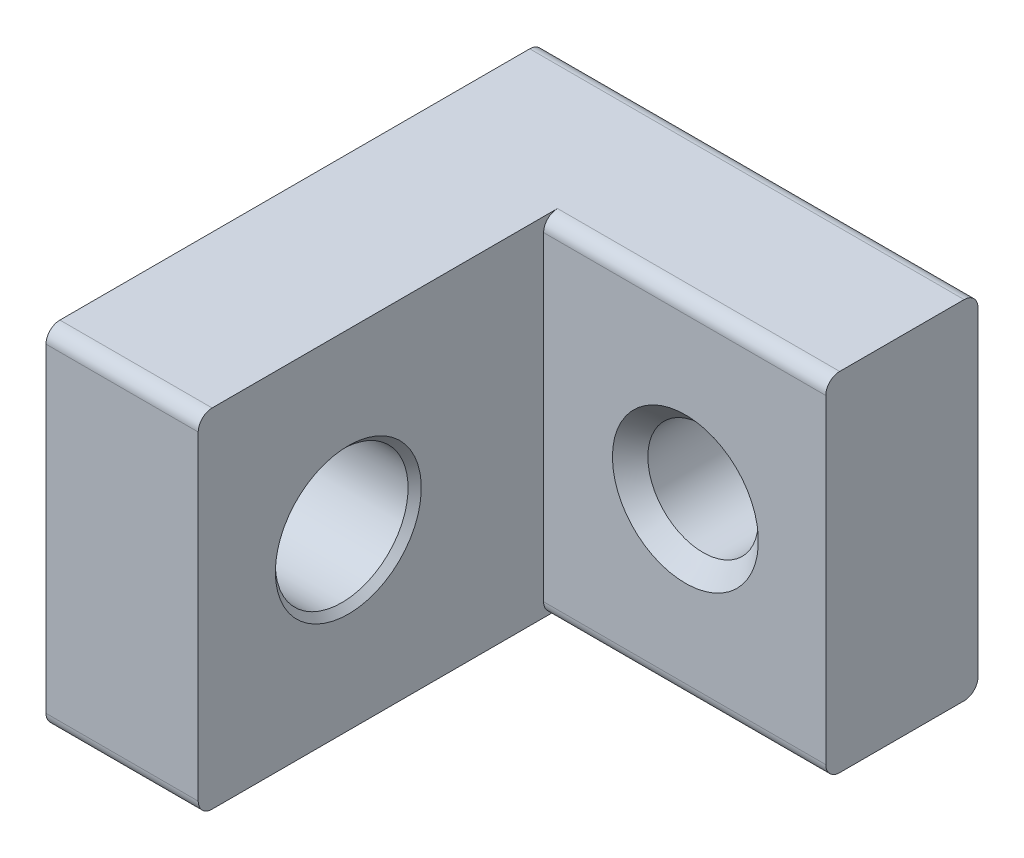
ISO-10303-21;
HEADER;
FILE_DESCRIPTION(('STEP AP214'),'2;1');
FILE_NAME('part.step','',(''),(''),'','','');
FILE_SCHEMA(('AUTOMOTIVE_DESIGN { 1 0 10303 214 1 1 1 1 }'));
ENDSEC;
DATA;
#1=APPLICATION_CONTEXT('core data for automotive mechanical design processes');
#2=APPLICATION_PROTOCOL_DEFINITION('international standard','automotive_design',2000,#1);
#3=PRODUCT_CONTEXT('',#1,'mechanical');
#4=PRODUCT('Part','Part','',(#3));
#5=PRODUCT_RELATED_PRODUCT_CATEGORY('part','',(#4));
#6=PRODUCT_DEFINITION_FORMATION('','',#4);
#7=PRODUCT_DEFINITION_CONTEXT('part definition',#1,'design');
#8=PRODUCT_DEFINITION('design','',#6,#7);
#9=PRODUCT_DEFINITION_SHAPE('','',#8);
#10=(LENGTH_UNIT() NAMED_UNIT(*) SI_UNIT(.MILLI.,.METRE.));
#11=(NAMED_UNIT(*) PLANE_ANGLE_UNIT() SI_UNIT($,.RADIAN.));
#12=(NAMED_UNIT(*) SI_UNIT($,.STERADIAN.) SOLID_ANGLE_UNIT());
#13=UNCERTAINTY_MEASURE_WITH_UNIT(LENGTH_MEASURE(1.E-05),#10,'distance_accuracy_value','');
#14=(GEOMETRIC_REPRESENTATION_CONTEXT(3) GLOBAL_UNCERTAINTY_ASSIGNED_CONTEXT((#13)) GLOBAL_UNIT_ASSIGNED_CONTEXT((#10,
#11,#12)) REPRESENTATION_CONTEXT('',''));
#15=CARTESIAN_POINT('',(0.,0.,0.));
#16=DIRECTION('',(0.,0.,1.));
#17=DIRECTION('',(1.,0.,0.));
#18=AXIS2_PLACEMENT_3D('',#15,#16,#17);
#19=CARTESIAN_POINT('',(0.381,6.35,0.));
#20=DIRECTION('',(1.,0.,0.));
#21=DIRECTION('',(0.,0.,-1.));
#22=AXIS2_PLACEMENT_3D('',#19,#20,#21);
#23=PLANE('',#22);
#24=CARTESIAN_POINT('',(0.381000000000002,0.,12.7));
#25=DIRECTION('',(-1.,0.,0.));
#26=DIRECTION('',(0.,0.,1.));
#27=AXIS2_PLACEMENT_3D('',#24,#25,#26);
#28=CIRCLE('',#27,2.667);
#29=CARTESIAN_POINT('',(0.381000000000002,0.,15.367));
#30=VERTEX_POINT('',#29);
#31=EDGE_CURVE('E248',#30,#30,#28,.T.);
#32=ORIENTED_EDGE('',*,*,#31,.F.);
#33=EDGE_LOOP('',(#32));
#34=FACE_BOUND('',#33,.T.);
#35=DIRECTION('',(0.,-1.,0.));
#36=VECTOR('',#35,1.);
#37=CARTESIAN_POINT('',(0.381,6.35,0.));
#38=LINE('',#37,#36);
#39=CARTESIAN_POINT('',(0.381,5.842,0.));
#40=VERTEX_POINT('',#39);
#41=CARTESIAN_POINT('',(0.381,-5.842,0.));
#42=VERTEX_POINT('',#41);
#43=EDGE_CURVE('E131',#40,#42,#38,.T.);
#44=ORIENTED_EDGE('',*,*,#43,.T.);
#45=CARTESIAN_POINT('',(0.381,-5.842,0.508));
#46=DIRECTION('',(1.,0.,0.));
#47=DIRECTION('',(0.,0.,-1.));
#48=AXIS2_PLACEMENT_3D('',#45,#46,#47);
#49=CIRCLE('',#48,0.508);
#50=CARTESIAN_POINT('',(0.381,-6.35,0.508));
#51=VERTEX_POINT('',#50);
#52=EDGE_CURVE('E167',#42,#51,#49,.F.);
#53=ORIENTED_EDGE('',*,*,#52,.T.);
#54=DIRECTION('',(0.,0.,1.));
#55=VECTOR('',#54,1.);
#56=CARTESIAN_POINT('',(0.381,-6.35,0.));
#57=LINE('',#56,#55);
#58=CARTESIAN_POINT('',(0.381000000000002,-6.35,17.6784));
#59=VERTEX_POINT('',#58);
#60=EDGE_CURVE('E235',#51,#59,#57,.T.);
#61=ORIENTED_EDGE('',*,*,#60,.T.);
#62=CARTESIAN_POINT('',(0.381000000000002,-5.842,17.6784));
#63=DIRECTION('',(1.,0.,0.));
#64=DIRECTION('',(0.,0.,-1.));
#65=AXIS2_PLACEMENT_3D('',#62,#63,#64);
#66=CIRCLE('',#65,0.508);
#67=CARTESIAN_POINT('',(0.381000000000002,-5.842,18.1864));
#68=VERTEX_POINT('',#67);
#69=EDGE_CURVE('E165',#59,#68,#66,.F.);
#70=ORIENTED_EDGE('',*,*,#69,.T.);
#71=DIRECTION('',(0.,-1.,0.));
#72=VECTOR('',#71,1.);
#73=CARTESIAN_POINT('',(0.381000000000002,6.35,18.1864));
#74=LINE('',#73,#72);
#75=CARTESIAN_POINT('',(0.381000000000002,5.842,18.1864));
#76=VERTEX_POINT('',#75);
#77=EDGE_CURVE('E154',#76,#68,#74,.T.);
#78=ORIENTED_EDGE('',*,*,#77,.F.);
#79=CARTESIAN_POINT('',(0.381000000000002,5.842,17.6784));
#80=DIRECTION('',(1.,0.,0.));
#81=DIRECTION('',(0.,0.,-1.));
#82=AXIS2_PLACEMENT_3D('',#79,#80,#81);
#83=CIRCLE('',#82,0.508);
#84=CARTESIAN_POINT('',(0.381000000000002,6.35,17.6784));
#85=VERTEX_POINT('',#84);
#86=EDGE_CURVE('E138',#76,#85,#83,.F.);
#87=ORIENTED_EDGE('',*,*,#86,.T.);
#88=DIRECTION('',(0.,0.,1.));
#89=VECTOR('',#88,1.);
#90=CARTESIAN_POINT('',(0.381,6.35,0.));
#91=LINE('',#90,#89);
#92=CARTESIAN_POINT('',(0.381,6.35,0.508000000000002));
#93=VERTEX_POINT('',#92);
#94=EDGE_CURVE('E133',#93,#85,#91,.T.);
#95=ORIENTED_EDGE('',*,*,#94,.F.);
#96=CARTESIAN_POINT('',(0.381,5.842,0.508000000000002));
#97=DIRECTION('',(1.,0.,0.));
#98=DIRECTION('',(0.,0.,-1.));
#99=AXIS2_PLACEMENT_3D('',#96,#97,#98);
#100=CIRCLE('',#99,0.508);
#101=EDGE_CURVE('E129',#93,#40,#100,.F.);
#102=ORIENTED_EDGE('',*,*,#101,.T.);
#103=EDGE_LOOP('',(#44,#53,#61,#70,#78,#87,#95,#102));
#104=FACE_BOUND('',#103,.T.);
#105=ADVANCED_FACE('F39',(#34,#104),#23,.F.);
#106=CARTESIAN_POINT('',(0.381000000000002,6.35,18.1864));
#107=DIRECTION('',(0.,0.,-1.));
#108=DIRECTION('',(-1.,0.,0.));
#109=AXIS2_PLACEMENT_3D('',#106,#107,#108);
#110=PLANE('',#109);
#111=ORIENTED_EDGE('',*,*,#77,.T.);
#112=DIRECTION('',(1.,0.,0.));
#113=VECTOR('',#112,1.);
#114=CARTESIAN_POINT('',(0.381000000000002,-5.842,18.1864));
#115=LINE('',#114,#113);
#116=CARTESIAN_POINT('',(5.9436,-5.842,18.1864));
#117=VERTEX_POINT('',#116);
#118=EDGE_CURVE('E190',#68,#117,#115,.T.);
#119=ORIENTED_EDGE('',*,*,#118,.T.);
#120=DIRECTION('',(0.,-1.,0.));
#121=VECTOR('',#120,1.);
#122=CARTESIAN_POINT('',(5.9436,6.35,18.1864));
#123=LINE('',#122,#121);
#124=CARTESIAN_POINT('',(5.9436,5.842,18.1864));
#125=VERTEX_POINT('',#124);
#126=EDGE_CURVE('E159',#125,#117,#123,.T.);
#127=ORIENTED_EDGE('',*,*,#126,.F.);
#128=DIRECTION('',(1.,0.,0.));
#129=VECTOR('',#128,1.);
#130=CARTESIAN_POINT('',(0.381000000000002,5.842,18.1864));
#131=LINE('',#130,#129);
#132=EDGE_CURVE('E188',#125,#76,#131,.F.);
#133=ORIENTED_EDGE('',*,*,#132,.T.);
#134=EDGE_LOOP('',(#111,#119,#127,#133));
#135=FACE_BOUND('',#134,.T.);
#136=ADVANCED_FACE('F294',(#135),#110,.F.);
#137=CARTESIAN_POINT('',(5.9436,6.35,18.1864));
#138=DIRECTION('',(-1.,0.,0.));
#139=DIRECTION('',(0.,0.,1.));
#140=AXIS2_PLACEMENT_3D('',#137,#138,#139);
#141=PLANE('',#140);
#142=CARTESIAN_POINT('',(5.9436,0.,12.7));
#143=DIRECTION('',(-1.,0.,0.));
#144=DIRECTION('',(0.,0.,1.));
#145=AXIS2_PLACEMENT_3D('',#142,#143,#144);
#146=CIRCLE('',#145,2.667);
#147=CARTESIAN_POINT('',(5.9436,0.,15.367));
#148=VERTEX_POINT('',#147);
#149=EDGE_CURVE('E263',#148,#148,#146,.T.);
#150=ORIENTED_EDGE('',*,*,#149,.T.);
#151=EDGE_LOOP('',(#150));
#152=FACE_BOUND('',#151,.T.);
#153=ORIENTED_EDGE('',*,*,#126,.T.);
#154=CARTESIAN_POINT('',(5.9436,-5.842,17.6784));
#155=DIRECTION('',(-1.,0.,0.));
#156=DIRECTION('',(0.,0.,1.));
#157=AXIS2_PLACEMENT_3D('',#154,#155,#156);
#158=CIRCLE('',#157,0.508);
#159=CARTESIAN_POINT('',(5.9436,-6.35,17.6784));
#160=VERTEX_POINT('',#159);
#161=EDGE_CURVE('E194',#117,#160,#158,.F.);
#162=ORIENTED_EDGE('',*,*,#161,.T.);
#163=DIRECTION('',(0.,0.,-1.));
#164=VECTOR('',#163,1.);
#165=CARTESIAN_POINT('',(5.9436,-6.35,18.1864));
#166=LINE('',#165,#164);
#167=CARTESIAN_POINT('',(5.9436,-6.35,5.0546));
#168=VERTEX_POINT('',#167);
#169=EDGE_CURVE('E210',#160,#168,#166,.T.);
#170=ORIENTED_EDGE('',*,*,#169,.T.);
#171=CARTESIAN_POINT('',(5.9436,-5.842,5.0546));
#172=DIRECTION('',(-1.,0.,0.));
#173=DIRECTION('',(0.,0.,1.));
#174=AXIS2_PLACEMENT_3D('',#171,#172,#173);
#175=CIRCLE('',#174,0.508);
#176=CARTESIAN_POINT('',(5.9436,-5.842,5.5626));
#177=VERTEX_POINT('',#176);
#178=EDGE_CURVE('E47',#168,#177,#175,.T.);
#179=ORIENTED_EDGE('',*,*,#178,.T.);
#180=DIRECTION('',(0.,-1.,0.));
#181=VECTOR('',#180,1.);
#182=CARTESIAN_POINT('',(5.9436,6.35,5.5626));
#183=LINE('',#182,#181);
#184=CARTESIAN_POINT('',(5.9436,5.842,5.5626));
#185=VERTEX_POINT('',#184);
#186=EDGE_CURVE('E207',#185,#177,#183,.T.);
#187=ORIENTED_EDGE('',*,*,#186,.F.);
#188=CARTESIAN_POINT('',(5.9436,5.842,5.0546));
#189=DIRECTION('',(-1.,0.,0.));
#190=DIRECTION('',(0.,0.,1.));
#191=AXIS2_PLACEMENT_3D('',#188,#189,#190);
#192=CIRCLE('',#191,0.508);
#193=CARTESIAN_POINT('',(5.9436,6.35,5.0546));
#194=VERTEX_POINT('',#193);
#195=EDGE_CURVE('E12',#185,#194,#192,.T.);
#196=ORIENTED_EDGE('',*,*,#195,.T.);
#197=DIRECTION('',(0.,0.,-1.));
#198=VECTOR('',#197,1.);
#199=CARTESIAN_POINT('',(5.9436,6.35,18.1864));
#200=LINE('',#199,#198);
#201=CARTESIAN_POINT('',(5.9436,6.35,17.6784));
#202=VERTEX_POINT('',#201);
#203=EDGE_CURVE('E54',#202,#194,#200,.T.);
#204=ORIENTED_EDGE('',*,*,#203,.F.);
#205=CARTESIAN_POINT('',(5.9436,5.842,17.6784));
#206=DIRECTION('',(-1.,0.,0.));
#207=DIRECTION('',(0.,0.,1.));
#208=AXIS2_PLACEMENT_3D('',#205,#206,#207);
#209=CIRCLE('',#208,0.508);
#210=EDGE_CURVE('E61',#202,#125,#209,.F.);
#211=ORIENTED_EDGE('',*,*,#210,.T.);
#212=EDGE_LOOP('',(#153,#162,#170,#179,#187,#196,#204,#211));
#213=FACE_BOUND('',#212,.T.);
#214=ADVANCED_FACE('F206',(#152,#213),#141,.F.);
#215=CARTESIAN_POINT('',(5.9436,6.35,5.5626));
#216=DIRECTION('',(0.,0.,-1.));
#217=DIRECTION('',(-1.,0.,0.));
#218=AXIS2_PLACEMENT_3D('',#215,#216,#217);
#219=PLANE('',#218);
#220=CARTESIAN_POINT('',(11.1252,0.,5.5626));
#221=DIRECTION('',(0.,0.,-1.));
#222=DIRECTION('',(-1.,0.,0.));
#223=AXIS2_PLACEMENT_3D('',#220,#221,#222);
#224=CIRCLE('',#223,2.667);
#225=CARTESIAN_POINT('',(8.4582,0.,5.5626));
#226=VERTEX_POINT('',#225);
#227=EDGE_CURVE('E255',#226,#226,#224,.T.);
#228=ORIENTED_EDGE('',*,*,#227,.T.);
#229=EDGE_LOOP('',(#228));
#230=FACE_BOUND('',#229,.T.);
#231=ORIENTED_EDGE('',*,*,#186,.T.);
#232=DIRECTION('',(1.,0.,0.));
#233=VECTOR('',#232,1.);
#234=CARTESIAN_POINT('',(5.9436,-5.842,5.5626));
#235=LINE('',#234,#233);
#236=CARTESIAN_POINT('',(16.256,-5.842,5.5626));
#237=VERTEX_POINT('',#236);
#238=EDGE_CURVE('E185',#177,#237,#235,.T.);
#239=ORIENTED_EDGE('',*,*,#238,.T.);
#240=DIRECTION('',(0.,-1.,0.));
#241=VECTOR('',#240,1.);
#242=CARTESIAN_POINT('',(16.256,6.35,5.5626));
#243=LINE('',#242,#241);
#244=CARTESIAN_POINT('',(16.256,5.842,5.5626));
#245=VERTEX_POINT('',#244);
#246=EDGE_CURVE('E220',#245,#237,#243,.T.);
#247=ORIENTED_EDGE('',*,*,#246,.F.);
#248=DIRECTION('',(1.,0.,0.));
#249=VECTOR('',#248,1.);
#250=CARTESIAN_POINT('',(5.9436,5.842,5.5626));
#251=LINE('',#250,#249);
#252=EDGE_CURVE('E183',#245,#185,#251,.F.);
#253=ORIENTED_EDGE('',*,*,#252,.T.);
#254=EDGE_LOOP('',(#231,#239,#247,#253));
#255=FACE_BOUND('',#254,.T.);
#256=ADVANCED_FACE('F215',(#230,#255),#219,.F.);
#257=CARTESIAN_POINT('',(16.256,6.35,0.));
#258=DIRECTION('',(-1.,0.,0.));
#259=DIRECTION('',(0.,0.,1.));
#260=AXIS2_PLACEMENT_3D('',#257,#258,#259);
#261=PLANE('',#260);
#262=DIRECTION('',(0.,0.,-1.));
#263=VECTOR('',#262,1.);
#264=CARTESIAN_POINT('',(16.256,-6.35,0.));
#265=LINE('',#264,#263);
#266=CARTESIAN_POINT('',(16.256,-6.35,5.0546));
#267=VERTEX_POINT('',#266);
#268=CARTESIAN_POINT('',(16.256,-6.35,0.508));
#269=VERTEX_POINT('',#268);
#270=EDGE_CURVE('E227',#267,#269,#265,.T.);
#271=ORIENTED_EDGE('',*,*,#270,.T.);
#272=CARTESIAN_POINT('',(16.256,-5.842,0.508));
#273=DIRECTION('',(-1.,0.,0.));
#274=DIRECTION('',(0.,0.,1.));
#275=AXIS2_PLACEMENT_3D('',#272,#273,#274);
#276=CIRCLE('',#275,0.508);
#277=CARTESIAN_POINT('',(16.256,-5.842,0.));
#278=VERTEX_POINT('',#277);
#279=EDGE_CURVE('E181',#269,#278,#276,.F.);
#280=ORIENTED_EDGE('',*,*,#279,.T.);
#281=DIRECTION('',(0.,-1.,0.));
#282=VECTOR('',#281,1.);
#283=CARTESIAN_POINT('',(16.256,6.35,0.));
#284=LINE('',#283,#282);
#285=CARTESIAN_POINT('',(16.256,5.842,0.));
#286=VERTEX_POINT('',#285);
#287=EDGE_CURVE('E149',#286,#278,#284,.T.);
#288=ORIENTED_EDGE('',*,*,#287,.F.);
#289=CARTESIAN_POINT('',(16.256,5.842,0.508000000000002));
#290=DIRECTION('',(-1.,0.,0.));
#291=DIRECTION('',(0.,0.,1.));
#292=AXIS2_PLACEMENT_3D('',#289,#290,#291);
#293=CIRCLE('',#292,0.508);
#294=CARTESIAN_POINT('',(16.256,6.35,0.508000000000001));
#295=VERTEX_POINT('',#294);
#296=EDGE_CURVE('E153',#286,#295,#293,.F.);
#297=ORIENTED_EDGE('',*,*,#296,.T.);
#298=DIRECTION('',(0.,0.,-1.));
#299=VECTOR('',#298,1.);
#300=CARTESIAN_POINT('',(16.256,6.35,0.));
#301=LINE('',#300,#299);
#302=CARTESIAN_POINT('',(16.256,6.35,5.0546));
#303=VERTEX_POINT('',#302);
#304=EDGE_CURVE('E150',#303,#295,#301,.T.);
#305=ORIENTED_EDGE('',*,*,#304,.F.);
#306=CARTESIAN_POINT('',(16.256,5.842,5.0546));
#307=DIRECTION('',(-1.,0.,0.));
#308=DIRECTION('',(0.,0.,1.));
#309=AXIS2_PLACEMENT_3D('',#306,#307,#308);
#310=CIRCLE('',#309,0.508);
#311=EDGE_CURVE('E177',#303,#245,#310,.F.);
#312=ORIENTED_EDGE('',*,*,#311,.T.);
#313=ORIENTED_EDGE('',*,*,#246,.T.);
#314=CARTESIAN_POINT('',(16.256,-5.842,5.0546));
#315=DIRECTION('',(-1.,0.,0.));
#316=DIRECTION('',(0.,0.,1.));
#317=AXIS2_PLACEMENT_3D('',#314,#315,#316);
#318=CIRCLE('',#317,0.508);
#319=EDGE_CURVE('E179',#237,#267,#318,.F.);
#320=ORIENTED_EDGE('',*,*,#319,.T.);
#321=EDGE_LOOP('',(#271,#280,#288,#297,#305,#312,#313,#320));
#322=FACE_BOUND('',#321,.T.);
#323=ADVANCED_FACE('F226',(#322),#261,.F.);
#324=CARTESIAN_POINT('',(0.381,6.35,0.));
#325=DIRECTION('',(0.,0.,1.));
#326=DIRECTION('',(1.,0.,0.));
#327=AXIS2_PLACEMENT_3D('',#324,#325,#326);
#328=PLANE('',#327);
#329=CARTESIAN_POINT('',(11.1252,0.,0.));
#330=DIRECTION('',(0.,0.,-1.));
#331=DIRECTION('',(-1.,0.,0.));
#332=AXIS2_PLACEMENT_3D('',#329,#330,#331);
#333=CIRCLE('',#332,2.667);
#334=CARTESIAN_POINT('',(8.4582,0.,0.));
#335=VERTEX_POINT('',#334);
#336=EDGE_CURVE('E425',#335,#335,#333,.T.);
#337=ORIENTED_EDGE('',*,*,#336,.F.);
#338=EDGE_LOOP('',(#337));
#339=FACE_BOUND('',#338,.T.);
#340=ORIENTED_EDGE('',*,*,#287,.T.);
#341=DIRECTION('',(-1.,0.,0.));
#342=VECTOR('',#341,1.);
#343=CARTESIAN_POINT('',(0.381,-5.842,0.));
#344=LINE('',#343,#342);
#345=EDGE_CURVE('E139',#278,#42,#344,.T.);
#346=ORIENTED_EDGE('',*,*,#345,.T.);
#347=ORIENTED_EDGE('',*,*,#43,.F.);
#348=DIRECTION('',(-1.,0.,0.));
#349=VECTOR('',#348,1.);
#350=CARTESIAN_POINT('',(16.256,5.842,0.));
#351=LINE('',#350,#349);
#352=EDGE_CURVE('E145',#40,#286,#351,.F.);
#353=ORIENTED_EDGE('',*,*,#352,.T.);
#354=EDGE_LOOP('',(#340,#346,#347,#353));
#355=FACE_BOUND('',#354,.T.);
#356=ADVANCED_FACE('F144',(#339,#355),#328,.F.);
#357=CARTESIAN_POINT('',(0.381000000000002,6.35,18.1864));
#358=DIRECTION('',(0.,1.,0.));
#359=DIRECTION('',(0.,0.,1.));
#360=AXIS2_PLACEMENT_3D('',#357,#358,#359);
#361=PLANE('',#360);
#362=ORIENTED_EDGE('',*,*,#94,.T.);
#363=DIRECTION('',(1.,0.,0.));
#364=VECTOR('',#363,1.);
#365=CARTESIAN_POINT('',(5.9436,6.35,17.6784));
#366=LINE('',#365,#364);
#367=EDGE_CURVE('E200',#85,#202,#366,.T.);
#368=ORIENTED_EDGE('',*,*,#367,.T.);
#369=ORIENTED_EDGE('',*,*,#203,.T.);
#370=DIRECTION('',(1.,0.,0.));
#371=VECTOR('',#370,1.);
#372=CARTESIAN_POINT('',(16.256,6.35,5.0546));
#373=LINE('',#372,#371);
#374=EDGE_CURVE('E198',#194,#303,#373,.T.);
#375=ORIENTED_EDGE('',*,*,#374,.T.);
#376=ORIENTED_EDGE('',*,*,#304,.T.);
#377=DIRECTION('',(-1.,0.,0.));
#378=VECTOR('',#377,1.);
#379=CARTESIAN_POINT('',(0.381,6.35,0.508000000000002));
#380=LINE('',#379,#378);
#381=EDGE_CURVE('E196',#295,#93,#380,.T.);
#382=ORIENTED_EDGE('',*,*,#381,.T.);
#383=EDGE_LOOP('',(#362,#368,#369,#375,#376,#382));
#384=FACE_BOUND('',#383,.T.);
#385=ADVANCED_FACE('F288',(#384),#361,.T.);
#386=CARTESIAN_POINT('',(0.381000000000002,-6.35,18.1864));
#387=DIRECTION('',(0.,1.,0.));
#388=DIRECTION('',(0.,0.,1.));
#389=AXIS2_PLACEMENT_3D('',#386,#387,#388);
#390=PLANE('',#389);
#391=ORIENTED_EDGE('',*,*,#60,.F.);
#392=DIRECTION('',(-1.,0.,0.));
#393=VECTOR('',#392,1.);
#394=CARTESIAN_POINT('',(0.381000000000002,-6.35,0.508000000000002));
#395=LINE('',#394,#393);
#396=EDGE_CURVE('E174',#51,#269,#395,.F.);
#397=ORIENTED_EDGE('',*,*,#396,.T.);
#398=ORIENTED_EDGE('',*,*,#270,.F.);
#399=DIRECTION('',(1.,0.,0.));
#400=VECTOR('',#399,1.);
#401=CARTESIAN_POINT('',(0.381000000000002,-6.35,5.0546));
#402=LINE('',#401,#400);
#403=EDGE_CURVE('E171',#267,#168,#402,.F.);
#404=ORIENTED_EDGE('',*,*,#403,.T.);
#405=ORIENTED_EDGE('',*,*,#169,.F.);
#406=DIRECTION('',(1.,0.,0.));
#407=VECTOR('',#406,1.);
#408=CARTESIAN_POINT('',(0.381000000000002,-6.35,17.6784));
#409=LINE('',#408,#407);
#410=EDGE_CURVE('E169',#160,#59,#409,.F.);
#411=ORIENTED_EDGE('',*,*,#410,.T.);
#412=EDGE_LOOP('',(#391,#397,#398,#404,#405,#411));
#413=FACE_BOUND('',#412,.T.);
#414=ADVANCED_FACE('F231',(#413),#390,.F.);
#415=CARTESIAN_POINT('',(5.7023,0.,12.7));
#416=DIRECTION('',(1.,0.,0.));
#417=DIRECTION('',(0.,0.,-1.));
#418=AXIS2_PLACEMENT_3D('',#415,#416,#417);
#419=CONICAL_SURFACE('',#418,2.4257,0.785398163397448);
#420=ORIENTED_EDGE('',*,*,#149,.F.);
#421=EDGE_LOOP('',(#420));
#422=FACE_BOUND('',#421,.T.);
#423=CARTESIAN_POINT('',(5.7023,0.,12.7));
#424=DIRECTION('',(-1.,0.,0.));
#425=DIRECTION('',(0.,0.,1.));
#426=AXIS2_PLACEMENT_3D('',#423,#424,#425);
#427=CIRCLE('',#426,2.4257);
#428=CARTESIAN_POINT('',(5.7023,0.,15.1257));
#429=VERTEX_POINT('',#428);
#430=EDGE_CURVE('E260',#429,#429,#427,.T.);
#431=ORIENTED_EDGE('',*,*,#430,.T.);
#432=EDGE_LOOP('',(#431));
#433=FACE_BOUND('',#432,.T.);
#434=ADVANCED_FACE('F345',(#422,#433),#419,.F.);
#435=CARTESIAN_POINT('',(0.381000000000002,0.,12.7));
#436=DIRECTION('',(-1.,0.,0.));
#437=DIRECTION('',(0.,0.,1.));
#438=AXIS2_PLACEMENT_3D('',#435,#436,#437);
#439=CYLINDRICAL_SURFACE('',#438,2.4257);
#440=ORIENTED_EDGE('',*,*,#430,.F.);
#441=EDGE_LOOP('',(#440));
#442=FACE_BOUND('',#441,.T.);
#443=CARTESIAN_POINT('',(0.622300000000001,0.,12.7));
#444=DIRECTION('',(-1.,0.,0.));
#445=DIRECTION('',(0.,0.,1.));
#446=AXIS2_PLACEMENT_3D('',#443,#444,#445);
#447=CIRCLE('',#446,2.4257);
#448=CARTESIAN_POINT('',(0.622300000000001,0.,15.1257));
#449=VERTEX_POINT('',#448);
#450=EDGE_CURVE('E254',#449,#449,#447,.T.);
#451=ORIENTED_EDGE('',*,*,#450,.T.);
#452=EDGE_LOOP('',(#451));
#453=FACE_BOUND('',#452,.T.);
#454=ADVANCED_FACE('F341',(#442,#453),#439,.F.);
#455=CARTESIAN_POINT('',(0.381000000000002,0.,12.7));
#456=DIRECTION('',(-1.,0.,0.));
#457=DIRECTION('',(0.,0.,1.));
#458=AXIS2_PLACEMENT_3D('',#455,#456,#457);
#459=CONICAL_SURFACE('',#458,2.667,0.785398163397452);
#460=ORIENTED_EDGE('',*,*,#450,.F.);
#461=EDGE_LOOP('',(#460));
#462=FACE_BOUND('',#461,.T.);
#463=ORIENTED_EDGE('',*,*,#31,.T.);
#464=EDGE_LOOP('',(#463));
#465=FACE_BOUND('',#464,.T.);
#466=ADVANCED_FACE('F337',(#462,#465),#459,.F.);
#467=CARTESIAN_POINT('',(11.1252,0.,4.9149));
#468=DIRECTION('',(0.,0.,1.));
#469=DIRECTION('',(1.,0.,0.));
#470=AXIS2_PLACEMENT_3D('',#467,#468,#469);
#471=CONICAL_SURFACE('',#470,2.0193,0.785398163397449);
#472=ORIENTED_EDGE('',*,*,#227,.F.);
#473=EDGE_LOOP('',(#472));
#474=FACE_BOUND('',#473,.T.);
#475=CARTESIAN_POINT('',(11.1252,0.,4.9149));
#476=DIRECTION('',(0.,0.,-1.));
#477=DIRECTION('',(-1.,0.,0.));
#478=AXIS2_PLACEMENT_3D('',#475,#476,#477);
#479=CIRCLE('',#478,2.0193);
#480=CARTESIAN_POINT('',(9.1059,0.,4.9149));
#481=VERTEX_POINT('',#480);
#482=EDGE_CURVE('E448',#481,#481,#479,.T.);
#483=ORIENTED_EDGE('',*,*,#482,.T.);
#484=EDGE_LOOP('',(#483));
#485=FACE_BOUND('',#484,.T.);
#486=ADVANCED_FACE('F329',(#474,#485),#471,.F.);
#487=CARTESIAN_POINT('',(11.1252,0.,0.));
#488=DIRECTION('',(0.,0.,-1.));
#489=DIRECTION('',(-1.,0.,0.));
#490=AXIS2_PLACEMENT_3D('',#487,#488,#489);
#491=CYLINDRICAL_SURFACE('',#490,2.0193);
#492=ORIENTED_EDGE('',*,*,#482,.F.);
#493=EDGE_LOOP('',(#492));
#494=FACE_BOUND('',#493,.T.);
#495=CARTESIAN_POINT('',(11.1252,0.,0.647699999999999));
#496=DIRECTION('',(0.,0.,-1.));
#497=DIRECTION('',(-1.,0.,0.));
#498=AXIS2_PLACEMENT_3D('',#495,#496,#497);
#499=CIRCLE('',#498,2.0193);
#500=CARTESIAN_POINT('',(9.1059,0.,0.647699999999999));
#501=VERTEX_POINT('',#500);
#502=EDGE_CURVE('E430',#501,#501,#499,.T.);
#503=ORIENTED_EDGE('',*,*,#502,.T.);
#504=EDGE_LOOP('',(#503));
#505=FACE_BOUND('',#504,.T.);
#506=ADVANCED_FACE('F324',(#494,#505),#491,.F.);
#507=CARTESIAN_POINT('',(11.1252,0.,0.));
#508=DIRECTION('',(0.,0.,-1.));
#509=DIRECTION('',(-1.,0.,0.));
#510=AXIS2_PLACEMENT_3D('',#507,#508,#509);
#511=CONICAL_SURFACE('',#510,2.667,0.785398163397448);
#512=ORIENTED_EDGE('',*,*,#502,.F.);
#513=EDGE_LOOP('',(#512));
#514=FACE_BOUND('',#513,.T.);
#515=ORIENTED_EDGE('',*,*,#336,.T.);
#516=EDGE_LOOP('',(#515));
#517=FACE_BOUND('',#516,.T.);
#518=ADVANCED_FACE('F320',(#514,#517),#511,.F.);
#519=CARTESIAN_POINT('',(0.381,-5.842,0.508));
#520=DIRECTION('',(-1.,0.,0.));
#521=DIRECTION('',(0.,0.,1.));
#522=AXIS2_PLACEMENT_3D('',#519,#520,#521);
#523=CYLINDRICAL_SURFACE('',#522,0.508);
#524=ORIENTED_EDGE('',*,*,#279,.F.);
#525=ORIENTED_EDGE('',*,*,#396,.F.);
#526=ORIENTED_EDGE('',*,*,#52,.F.);
#527=ORIENTED_EDGE('',*,*,#345,.F.);
#528=EDGE_LOOP('',(#524,#525,#526,#527));
#529=FACE_BOUND('',#528,.T.);
#530=ADVANCED_FACE('F281',(#529),#523,.T.);
#531=CARTESIAN_POINT('',(5.9436,-5.842,5.0546));
#532=DIRECTION('',(1.,0.,0.));
#533=DIRECTION('',(0.,0.,-1.));
#534=AXIS2_PLACEMENT_3D('',#531,#532,#533);
#535=CYLINDRICAL_SURFACE('',#534,0.508);
#536=ORIENTED_EDGE('',*,*,#178,.F.);
#537=ORIENTED_EDGE('',*,*,#403,.F.);
#538=ORIENTED_EDGE('',*,*,#319,.F.);
#539=ORIENTED_EDGE('',*,*,#238,.F.);
#540=EDGE_LOOP('',(#536,#537,#538,#539));
#541=FACE_BOUND('',#540,.T.);
#542=ADVANCED_FACE('F222',(#541),#535,.T.);
#543=CARTESIAN_POINT('',(0.381000000000002,-5.842,17.6784));
#544=DIRECTION('',(1.,0.,0.));
#545=DIRECTION('',(0.,0.,-1.));
#546=AXIS2_PLACEMENT_3D('',#543,#544,#545);
#547=CYLINDRICAL_SURFACE('',#546,0.508);
#548=ORIENTED_EDGE('',*,*,#69,.F.);
#549=ORIENTED_EDGE('',*,*,#410,.F.);
#550=ORIENTED_EDGE('',*,*,#161,.F.);
#551=ORIENTED_EDGE('',*,*,#118,.F.);
#552=EDGE_LOOP('',(#548,#549,#550,#551));
#553=FACE_BOUND('',#552,.T.);
#554=ADVANCED_FACE('F300',(#553),#547,.T.);
#555=CARTESIAN_POINT('',(0.381000000000002,5.842,17.6784));
#556=DIRECTION('',(-1.,0.,0.));
#557=DIRECTION('',(0.,0.,1.));
#558=AXIS2_PLACEMENT_3D('',#555,#556,#557);
#559=CYLINDRICAL_SURFACE('',#558,0.508);
#560=ORIENTED_EDGE('',*,*,#86,.F.);
#561=ORIENTED_EDGE('',*,*,#132,.F.);
#562=ORIENTED_EDGE('',*,*,#210,.F.);
#563=ORIENTED_EDGE('',*,*,#367,.F.);
#564=EDGE_LOOP('',(#560,#561,#562,#563));
#565=FACE_BOUND('',#564,.T.);
#566=ADVANCED_FACE('F298',(#565),#559,.T.);
#567=CARTESIAN_POINT('',(0.381000000000002,5.842,5.0546));
#568=DIRECTION('',(-1.,0.,0.));
#569=DIRECTION('',(0.,0.,1.));
#570=AXIS2_PLACEMENT_3D('',#567,#568,#569);
#571=CYLINDRICAL_SURFACE('',#570,0.508);
#572=ORIENTED_EDGE('',*,*,#195,.F.);
#573=ORIENTED_EDGE('',*,*,#252,.F.);
#574=ORIENTED_EDGE('',*,*,#311,.F.);
#575=ORIENTED_EDGE('',*,*,#374,.F.);
#576=EDGE_LOOP('',(#572,#573,#574,#575));
#577=FACE_BOUND('',#576,.T.);
#578=ADVANCED_FACE('F291',(#577),#571,.T.);
#579=CARTESIAN_POINT('',(0.381000000000002,5.842,0.508000000000002));
#580=DIRECTION('',(1.,0.,0.));
#581=DIRECTION('',(0.,0.,-1.));
#582=AXIS2_PLACEMENT_3D('',#579,#580,#581);
#583=CYLINDRICAL_SURFACE('',#582,0.508);
#584=ORIENTED_EDGE('',*,*,#296,.F.);
#585=ORIENTED_EDGE('',*,*,#352,.F.);
#586=ORIENTED_EDGE('',*,*,#101,.F.);
#587=ORIENTED_EDGE('',*,*,#381,.F.);
#588=EDGE_LOOP('',(#584,#585,#586,#587));
#589=FACE_BOUND('',#588,.T.);
#590=ADVANCED_FACE('F41',(#589),#583,.T.);
#591=CLOSED_SHELL('',(#105,#136,#214,#256,#323,#356,#385,#414,#434,#454,#466,#486,#506,#518,
#530,#542,#554,#566,#578,#590));
#592=MANIFOLD_SOLID_BREP('B2',#591);
#593=ADVANCED_BREP_SHAPE_REPRESENTATION('',(#18,#592),#14);
#594=SHAPE_DEFINITION_REPRESENTATION(#9,#593);
ENDSEC;
END-ISO-10303-21;
